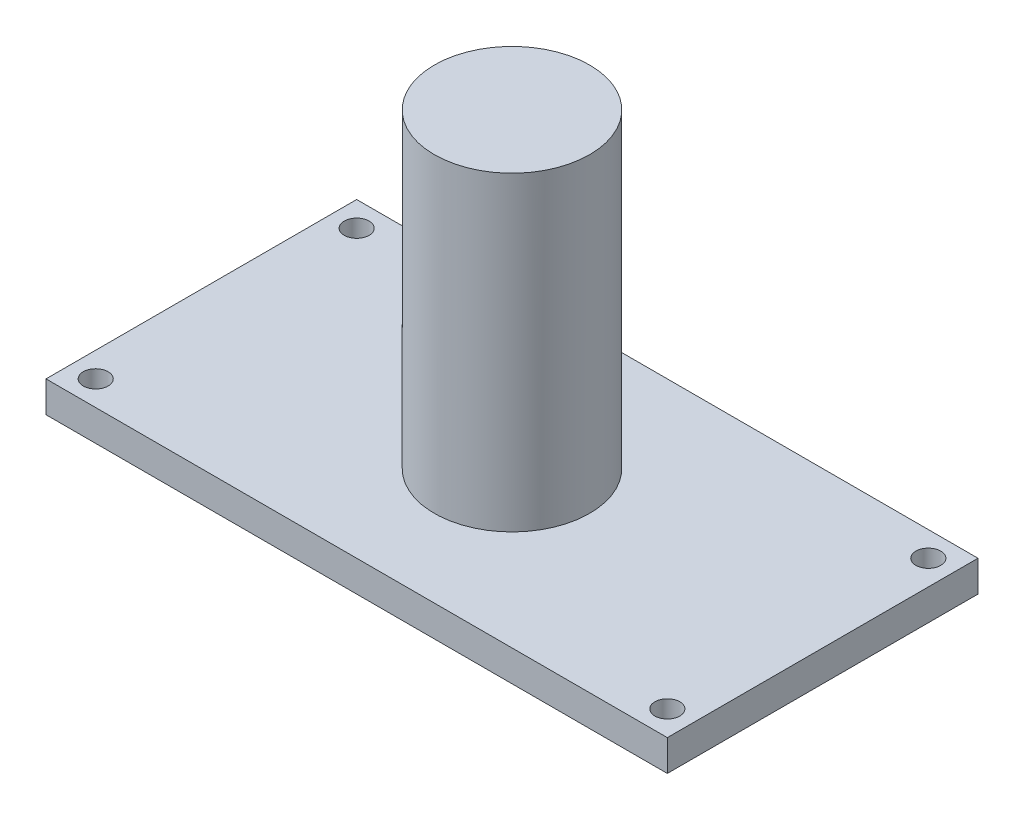
ISO-10303-21;
HEADER;
FILE_DESCRIPTION(('STEP AP214'),'2;1');
FILE_NAME('part.step','',(''),(''),'','','');
FILE_SCHEMA(('AUTOMOTIVE_DESIGN { 1 0 10303 214 1 1 1 1 }'));
ENDSEC;
DATA;
#1=APPLICATION_CONTEXT('core data for automotive mechanical design processes');
#2=APPLICATION_PROTOCOL_DEFINITION('international standard','automotive_design',2000,#1);
#3=PRODUCT_CONTEXT('',#1,'mechanical');
#4=PRODUCT('Part','Part','',(#3));
#5=PRODUCT_RELATED_PRODUCT_CATEGORY('part','',(#4));
#6=PRODUCT_DEFINITION_FORMATION('','',#4);
#7=PRODUCT_DEFINITION_CONTEXT('part definition',#1,'design');
#8=PRODUCT_DEFINITION('design','',#6,#7);
#9=PRODUCT_DEFINITION_SHAPE('','',#8);
#10=(LENGTH_UNIT() NAMED_UNIT(*) SI_UNIT(.MILLI.,.METRE.));
#11=(NAMED_UNIT(*) PLANE_ANGLE_UNIT() SI_UNIT($,.RADIAN.));
#12=(NAMED_UNIT(*) SI_UNIT($,.STERADIAN.) SOLID_ANGLE_UNIT());
#13=UNCERTAINTY_MEASURE_WITH_UNIT(LENGTH_MEASURE(1.E-05),#10,'distance_accuracy_value','');
#14=(GEOMETRIC_REPRESENTATION_CONTEXT(3) GLOBAL_UNCERTAINTY_ASSIGNED_CONTEXT((#13)) GLOBAL_UNIT_ASSIGNED_CONTEXT((#10,
#11,#12)) REPRESENTATION_CONTEXT('',''));
#15=CARTESIAN_POINT('',(0.,0.,0.));
#16=DIRECTION('',(0.,0.,1.));
#17=DIRECTION('',(1.,0.,0.));
#18=AXIS2_PLACEMENT_3D('',#15,#16,#17);
#19=CARTESIAN_POINT('',(0.,10.,0.));
#20=DIRECTION('',(0.,-1.,0.));
#21=DIRECTION('',(0.,0.,-1.));
#22=AXIS2_PLACEMENT_3D('',#19,#20,#21);
#23=PLANE('',#22);
#24=CARTESIAN_POINT('',(0.,9.99999999999999,0.));
#25=DIRECTION('',(0.,-1.,0.));
#26=DIRECTION('',(0.,0.,-1.));
#27=AXIS2_PLACEMENT_3D('',#24,#25,#26);
#28=CIRCLE('',#27,25.);
#29=CARTESIAN_POINT('',(0.,9.99999999999999,-25.));
#30=VERTEX_POINT('',#29);
#31=EDGE_CURVE('E11',#30,#30,#28,.F.);
#32=ORIENTED_EDGE('',*,*,#31,.F.);
#33=EDGE_LOOP('',(#32));
#34=FACE_BOUND('',#33,.T.);
#35=DIRECTION('',(0.,0.,-1.));
#36=VECTOR('',#35,1.);
#37=CARTESIAN_POINT('',(100.,10.,50.));
#38=LINE('',#37,#36);
#39=CARTESIAN_POINT('',(100.,10.,50.));
#40=VERTEX_POINT('',#39);
#41=CARTESIAN_POINT('',(100.,10.,-50.));
#42=VERTEX_POINT('',#41);
#43=EDGE_CURVE('E86',#40,#42,#38,.T.);
#44=ORIENTED_EDGE('',*,*,#43,.T.);
#45=DIRECTION('',(-1.,0.,0.));
#46=VECTOR('',#45,1.);
#47=CARTESIAN_POINT('',(-100.,10.,-50.));
#48=LINE('',#47,#46);
#49=CARTESIAN_POINT('',(-100.,10.,-50.));
#50=VERTEX_POINT('',#49);
#51=EDGE_CURVE('E81',#42,#50,#48,.T.);
#52=ORIENTED_EDGE('',*,*,#51,.T.);
#53=DIRECTION('',(0.,0.,1.));
#54=VECTOR('',#53,1.);
#55=CARTESIAN_POINT('',(-100.,10.,50.));
#56=LINE('',#55,#54);
#57=CARTESIAN_POINT('',(-100.,10.,50.));
#58=VERTEX_POINT('',#57);
#59=EDGE_CURVE('E84',#50,#58,#56,.T.);
#60=ORIENTED_EDGE('',*,*,#59,.T.);
#61=DIRECTION('',(1.,0.,0.));
#62=VECTOR('',#61,1.);
#63=CARTESIAN_POINT('',(-100.,10.,50.));
#64=LINE('',#63,#62);
#65=EDGE_CURVE('E50',#58,#40,#64,.T.);
#66=ORIENTED_EDGE('',*,*,#65,.T.);
#67=EDGE_LOOP('',(#44,#52,#60,#66));
#68=FACE_BOUND('',#67,.T.);
#69=CARTESIAN_POINT('',(-92.,10.,-42.));
#70=DIRECTION('',(0.,1.,0.));
#71=DIRECTION('',(0.,0.,1.));
#72=AXIS2_PLACEMENT_3D('',#69,#70,#71);
#73=CIRCLE('',#72,4.00000000000001);
#74=CARTESIAN_POINT('',(-92.,10.,-38.));
#75=VERTEX_POINT('',#74);
#76=EDGE_CURVE('E103',#75,#75,#73,.T.);
#77=ORIENTED_EDGE('',*,*,#76,.F.);
#78=EDGE_LOOP('',(#77));
#79=FACE_BOUND('',#78,.T.);
#80=CARTESIAN_POINT('',(-92.,10.,42.));
#81=DIRECTION('',(0.,1.,0.));
#82=DIRECTION('',(0.,0.,1.));
#83=AXIS2_PLACEMENT_3D('',#80,#81,#82);
#84=CIRCLE('',#83,4.00000000000001);
#85=CARTESIAN_POINT('',(-92.,10.,46.));
#86=VERTEX_POINT('',#85);
#87=EDGE_CURVE('E138',#86,#86,#84,.T.);
#88=ORIENTED_EDGE('',*,*,#87,.F.);
#89=EDGE_LOOP('',(#88));
#90=FACE_BOUND('',#89,.T.);
#91=CARTESIAN_POINT('',(92.,10.,42.));
#92=DIRECTION('',(0.,1.,0.));
#93=DIRECTION('',(0.,0.,1.));
#94=AXIS2_PLACEMENT_3D('',#91,#92,#93);
#95=CIRCLE('',#94,4.00000000000001);
#96=CARTESIAN_POINT('',(92.,10.,46.));
#97=VERTEX_POINT('',#96);
#98=EDGE_CURVE('E133',#97,#97,#95,.T.);
#99=ORIENTED_EDGE('',*,*,#98,.F.);
#100=EDGE_LOOP('',(#99));
#101=FACE_BOUND('',#100,.T.);
#102=CARTESIAN_POINT('',(92.,10.,-42.));
#103=DIRECTION('',(0.,1.,0.));
#104=DIRECTION('',(0.,0.,1.));
#105=AXIS2_PLACEMENT_3D('',#102,#103,#104);
#106=CIRCLE('',#105,4.00000000000001);
#107=CARTESIAN_POINT('',(92.,10.,-38.));
#108=VERTEX_POINT('',#107);
#109=EDGE_CURVE('E124',#108,#108,#106,.T.);
#110=ORIENTED_EDGE('',*,*,#109,.F.);
#111=EDGE_LOOP('',(#110));
#112=FACE_BOUND('',#111,.T.);
#113=ADVANCED_FACE('F33',(#34,#68,#79,#90,#101,#112),#23,.F.);
#114=CARTESIAN_POINT('',(0.,0.,0.));
#115=DIRECTION('',(0.,-1.,0.));
#116=DIRECTION('',(0.,0.,-1.));
#117=AXIS2_PLACEMENT_3D('',#114,#115,#116);
#118=PLANE('',#117);
#119=CARTESIAN_POINT('',(92.,0.,42.));
#120=DIRECTION('',(0.,1.,0.));
#121=DIRECTION('',(0.,0.,1.));
#122=AXIS2_PLACEMENT_3D('',#119,#120,#121);
#123=CIRCLE('',#122,4.00000000000001);
#124=CARTESIAN_POINT('',(92.,0.,46.));
#125=VERTEX_POINT('',#124);
#126=EDGE_CURVE('E128',#125,#125,#123,.T.);
#127=ORIENTED_EDGE('',*,*,#126,.T.);
#128=EDGE_LOOP('',(#127));
#129=FACE_BOUND('',#128,.T.);
#130=CARTESIAN_POINT('',(-92.,0.,-42.));
#131=DIRECTION('',(0.,1.,0.));
#132=DIRECTION('',(0.,0.,1.));
#133=AXIS2_PLACEMENT_3D('',#130,#131,#132);
#134=CIRCLE('',#133,4.00000000000001);
#135=CARTESIAN_POINT('',(-92.,0.,-38.));
#136=VERTEX_POINT('',#135);
#137=EDGE_CURVE('E141',#136,#136,#134,.T.);
#138=ORIENTED_EDGE('',*,*,#137,.T.);
#139=EDGE_LOOP('',(#138));
#140=FACE_BOUND('',#139,.T.);
#141=DIRECTION('',(0.,0.,-1.));
#142=VECTOR('',#141,1.);
#143=CARTESIAN_POINT('',(100.,0.,50.));
#144=LINE('',#143,#142);
#145=CARTESIAN_POINT('',(100.,0.,50.));
#146=VERTEX_POINT('',#145);
#147=CARTESIAN_POINT('',(100.,0.,-50.));
#148=VERTEX_POINT('',#147);
#149=EDGE_CURVE('E100',#146,#148,#144,.T.);
#150=ORIENTED_EDGE('',*,*,#149,.F.);
#151=DIRECTION('',(1.,0.,0.));
#152=VECTOR('',#151,1.);
#153=CARTESIAN_POINT('',(-100.,0.,50.));
#154=LINE('',#153,#152);
#155=CARTESIAN_POINT('',(-100.,0.,50.));
#156=VERTEX_POINT('',#155);
#157=EDGE_CURVE('E73',#156,#146,#154,.T.);
#158=ORIENTED_EDGE('',*,*,#157,.F.);
#159=DIRECTION('',(0.,0.,1.));
#160=VECTOR('',#159,1.);
#161=CARTESIAN_POINT('',(-100.,0.,50.));
#162=LINE('',#161,#160);
#163=CARTESIAN_POINT('',(-100.,0.,-50.));
#164=VERTEX_POINT('',#163);
#165=EDGE_CURVE('E67',#164,#156,#162,.T.);
#166=ORIENTED_EDGE('',*,*,#165,.F.);
#167=DIRECTION('',(-1.,0.,0.));
#168=VECTOR('',#167,1.);
#169=CARTESIAN_POINT('',(-100.,0.,-50.));
#170=LINE('',#169,#168);
#171=EDGE_CURVE('E91',#148,#164,#170,.T.);
#172=ORIENTED_EDGE('',*,*,#171,.F.);
#173=EDGE_LOOP('',(#150,#158,#166,#172));
#174=FACE_BOUND('',#173,.T.);
#175=CARTESIAN_POINT('',(-92.,0.,42.));
#176=DIRECTION('',(0.,1.,0.));
#177=DIRECTION('',(0.,0.,1.));
#178=AXIS2_PLACEMENT_3D('',#175,#176,#177);
#179=CIRCLE('',#178,4.00000000000001);
#180=CARTESIAN_POINT('',(-92.,0.,46.));
#181=VERTEX_POINT('',#180);
#182=EDGE_CURVE('E119',#181,#181,#179,.T.);
#183=ORIENTED_EDGE('',*,*,#182,.T.);
#184=EDGE_LOOP('',(#183));
#185=FACE_BOUND('',#184,.T.);
#186=CARTESIAN_POINT('',(92.,0.,-42.));
#187=DIRECTION('',(0.,1.,0.));
#188=DIRECTION('',(0.,0.,1.));
#189=AXIS2_PLACEMENT_3D('',#186,#187,#188);
#190=CIRCLE('',#189,4.00000000000001);
#191=CARTESIAN_POINT('',(92.,0.,-38.));
#192=VERTEX_POINT('',#191);
#193=EDGE_CURVE('E122',#192,#192,#190,.T.);
#194=ORIENTED_EDGE('',*,*,#193,.T.);
#195=EDGE_LOOP('',(#194));
#196=FACE_BOUND('',#195,.T.);
#197=ADVANCED_FACE('F111',(#129,#140,#174,#185,#196),#118,.T.);
#198=CARTESIAN_POINT('',(100.,10.,50.));
#199=DIRECTION('',(-1.,0.,0.));
#200=DIRECTION('',(0.,0.,1.));
#201=AXIS2_PLACEMENT_3D('',#198,#199,#200);
#202=PLANE('',#201);
#203=ORIENTED_EDGE('',*,*,#149,.T.);
#204=DIRECTION('',(0.,-1.,0.));
#205=VECTOR('',#204,1.);
#206=CARTESIAN_POINT('',(100.,10.,-50.));
#207=LINE('',#206,#205);
#208=EDGE_CURVE('E42',#42,#148,#207,.T.);
#209=ORIENTED_EDGE('',*,*,#208,.F.);
#210=ORIENTED_EDGE('',*,*,#43,.F.);
#211=DIRECTION('',(0.,-1.,0.));
#212=VECTOR('',#211,1.);
#213=CARTESIAN_POINT('',(100.,10.,50.));
#214=LINE('',#213,#212);
#215=EDGE_CURVE('E96',#40,#146,#214,.T.);
#216=ORIENTED_EDGE('',*,*,#215,.T.);
#217=EDGE_LOOP('',(#203,#209,#210,#216));
#218=FACE_BOUND('',#217,.T.);
#219=ADVANCED_FACE('F35',(#218),#202,.F.);
#220=CARTESIAN_POINT('',(-100.,10.,-50.));
#221=DIRECTION('',(0.,0.,1.));
#222=DIRECTION('',(1.,0.,0.));
#223=AXIS2_PLACEMENT_3D('',#220,#221,#222);
#224=PLANE('',#223);
#225=ORIENTED_EDGE('',*,*,#171,.T.);
#226=DIRECTION('',(0.,-1.,0.));
#227=VECTOR('',#226,1.);
#228=CARTESIAN_POINT('',(-100.,10.,-50.));
#229=LINE('',#228,#227);
#230=EDGE_CURVE('E89',#50,#164,#229,.T.);
#231=ORIENTED_EDGE('',*,*,#230,.F.);
#232=ORIENTED_EDGE('',*,*,#51,.F.);
#233=ORIENTED_EDGE('',*,*,#208,.T.);
#234=EDGE_LOOP('',(#225,#231,#232,#233));
#235=FACE_BOUND('',#234,.T.);
#236=ADVANCED_FACE('F90',(#235),#224,.F.);
#237=CARTESIAN_POINT('',(-100.,10.,50.));
#238=DIRECTION('',(1.,0.,0.));
#239=DIRECTION('',(0.,0.,-1.));
#240=AXIS2_PLACEMENT_3D('',#237,#238,#239);
#241=PLANE('',#240);
#242=ORIENTED_EDGE('',*,*,#165,.T.);
#243=DIRECTION('',(0.,-1.,0.));
#244=VECTOR('',#243,1.);
#245=CARTESIAN_POINT('',(-100.,10.,50.));
#246=LINE('',#245,#244);
#247=EDGE_CURVE('E92',#58,#156,#246,.T.);
#248=ORIENTED_EDGE('',*,*,#247,.F.);
#249=ORIENTED_EDGE('',*,*,#59,.F.);
#250=ORIENTED_EDGE('',*,*,#230,.T.);
#251=EDGE_LOOP('',(#242,#248,#249,#250));
#252=FACE_BOUND('',#251,.T.);
#253=ADVANCED_FACE('F94',(#252),#241,.F.);
#254=CARTESIAN_POINT('',(-100.,10.,50.));
#255=DIRECTION('',(0.,0.,-1.));
#256=DIRECTION('',(-1.,0.,0.));
#257=AXIS2_PLACEMENT_3D('',#254,#255,#256);
#258=PLANE('',#257);
#259=ORIENTED_EDGE('',*,*,#157,.T.);
#260=ORIENTED_EDGE('',*,*,#215,.F.);
#261=ORIENTED_EDGE('',*,*,#65,.F.);
#262=ORIENTED_EDGE('',*,*,#247,.T.);
#263=EDGE_LOOP('',(#259,#260,#261,#262));
#264=FACE_BOUND('',#263,.T.);
#265=ADVANCED_FACE('F152',(#264),#258,.F.);
#266=CARTESIAN_POINT('',(-92.,10.,-42.));
#267=DIRECTION('',(0.,-1.,0.));
#268=DIRECTION('',(0.,0.,-1.));
#269=AXIS2_PLACEMENT_3D('',#266,#267,#268);
#270=CYLINDRICAL_SURFACE('',#269,4.00000000000001);
#271=ORIENTED_EDGE('',*,*,#76,.T.);
#272=EDGE_LOOP('',(#271));
#273=FACE_BOUND('',#272,.T.);
#274=ORIENTED_EDGE('',*,*,#137,.F.);
#275=EDGE_LOOP('',(#274));
#276=FACE_BOUND('',#275,.T.);
#277=ADVANCED_FACE('F149',(#273,#276),#270,.F.);
#278=CARTESIAN_POINT('',(-92.,10.,42.));
#279=DIRECTION('',(0.,-1.,0.));
#280=DIRECTION('',(0.,0.,-1.));
#281=AXIS2_PLACEMENT_3D('',#278,#279,#280);
#282=CYLINDRICAL_SURFACE('',#281,4.00000000000001);
#283=ORIENTED_EDGE('',*,*,#87,.T.);
#284=EDGE_LOOP('',(#283));
#285=FACE_BOUND('',#284,.T.);
#286=ORIENTED_EDGE('',*,*,#182,.F.);
#287=EDGE_LOOP('',(#286));
#288=FACE_BOUND('',#287,.T.);
#289=ADVANCED_FACE('F151',(#285,#288),#282,.F.);
#290=CARTESIAN_POINT('',(92.,10.,42.));
#291=DIRECTION('',(0.,-1.,0.));
#292=DIRECTION('',(0.,0.,-1.));
#293=AXIS2_PLACEMENT_3D('',#290,#291,#292);
#294=CYLINDRICAL_SURFACE('',#293,4.00000000000001);
#295=ORIENTED_EDGE('',*,*,#98,.T.);
#296=EDGE_LOOP('',(#295));
#297=FACE_BOUND('',#296,.T.);
#298=ORIENTED_EDGE('',*,*,#126,.F.);
#299=EDGE_LOOP('',(#298));
#300=FACE_BOUND('',#299,.T.);
#301=ADVANCED_FACE('F159',(#297,#300),#294,.F.);
#302=CARTESIAN_POINT('',(92.,10.,-42.));
#303=DIRECTION('',(0.,-1.,0.));
#304=DIRECTION('',(0.,0.,-1.));
#305=AXIS2_PLACEMENT_3D('',#302,#303,#304);
#306=CYLINDRICAL_SURFACE('',#305,4.00000000000001);
#307=ORIENTED_EDGE('',*,*,#109,.T.);
#308=EDGE_LOOP('',(#307));
#309=FACE_BOUND('',#308,.T.);
#310=ORIENTED_EDGE('',*,*,#193,.F.);
#311=EDGE_LOOP('',(#310));
#312=FACE_BOUND('',#311,.T.);
#313=ADVANCED_FACE('F219',(#309,#312),#306,.F.);
#314=CARTESIAN_POINT('',(0.,110.,0.));
#315=DIRECTION('',(0.,-1.,0.));
#316=DIRECTION('',(0.,0.,-1.));
#317=AXIS2_PLACEMENT_3D('',#314,#315,#316);
#318=CYLINDRICAL_SURFACE('',#317,25.);
#319=CARTESIAN_POINT('',(0.,110.,0.));
#320=DIRECTION('',(0.,1.,0.));
#321=DIRECTION('',(0.,0.,1.));
#322=AXIS2_PLACEMENT_3D('',#319,#320,#321);
#323=CIRCLE('',#322,25.);
#324=CARTESIAN_POINT('',(0.,110.,25.));
#325=VERTEX_POINT('',#324);
#326=EDGE_CURVE('E125',#325,#325,#323,.T.);
#327=ORIENTED_EDGE('',*,*,#326,.F.);
#328=EDGE_LOOP('',(#327));
#329=FACE_BOUND('',#328,.T.);
#330=ORIENTED_EDGE('',*,*,#31,.T.);
#331=EDGE_LOOP('',(#330));
#332=FACE_BOUND('',#331,.T.);
#333=ADVANCED_FACE('F228',(#329,#332),#318,.T.);
#334=CARTESIAN_POINT('',(0.,110.,0.));
#335=DIRECTION('',(0.,1.,0.));
#336=DIRECTION('',(0.,0.,1.));
#337=AXIS2_PLACEMENT_3D('',#334,#335,#336);
#338=PLANE('',#337);
#339=ORIENTED_EDGE('',*,*,#326,.T.);
#340=EDGE_LOOP('',(#339));
#341=FACE_BOUND('',#340,.T.);
#342=ADVANCED_FACE('F237',(#341),#338,.T.);
#343=CLOSED_SHELL('',(#113,#197,#219,#236,#253,#265,#277,#289,#301,#313,#333,#342));
#344=MANIFOLD_SOLID_BREP('B2',#343);
#345=ADVANCED_BREP_SHAPE_REPRESENTATION('',(#18,#344),#14);
#346=SHAPE_DEFINITION_REPRESENTATION(#9,#345);
ENDSEC;
END-ISO-10303-21;
